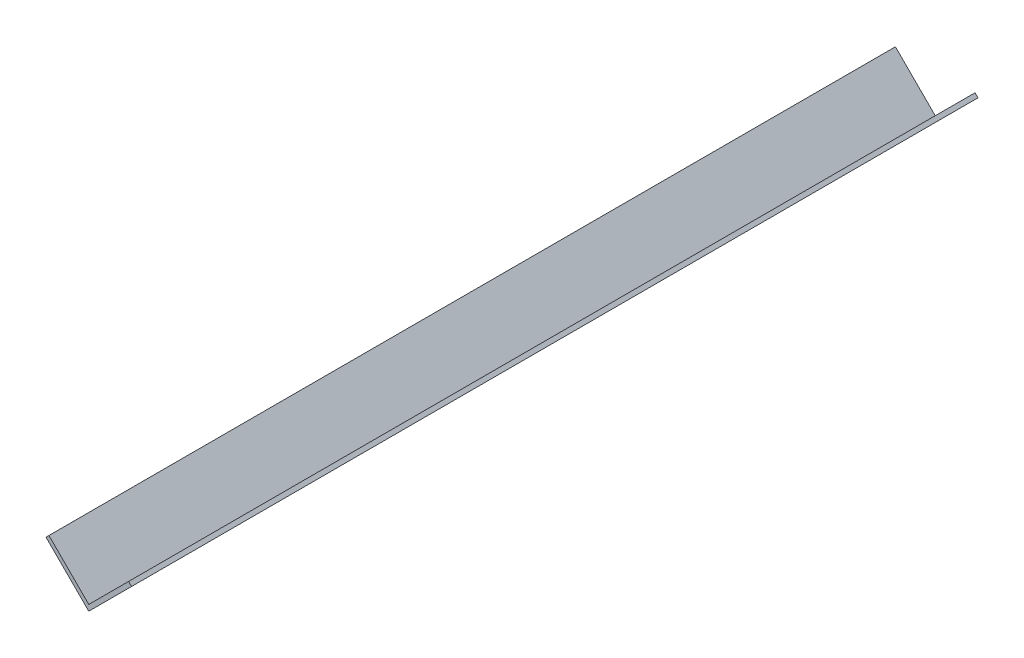
ISO-10303-21;
HEADER;
FILE_DESCRIPTION(('STEP AP214'),'2;1');
FILE_NAME('part.step','',(''),(''),'','','');
FILE_SCHEMA(('AUTOMOTIVE_DESIGN { 1 0 10303 214 1 1 1 1 }'));
ENDSEC;
DATA;
#1=APPLICATION_CONTEXT('core data for automotive mechanical design processes');
#2=APPLICATION_PROTOCOL_DEFINITION('international standard','automotive_design',2000,#1);
#3=PRODUCT_CONTEXT('',#1,'mechanical');
#4=PRODUCT('Part','Part','',(#3));
#5=PRODUCT_RELATED_PRODUCT_CATEGORY('part','',(#4));
#6=PRODUCT_DEFINITION_FORMATION('','',#4);
#7=PRODUCT_DEFINITION_CONTEXT('part definition',#1,'design');
#8=PRODUCT_DEFINITION('design','',#6,#7);
#9=PRODUCT_DEFINITION_SHAPE('','',#8);
#10=(LENGTH_UNIT() NAMED_UNIT(*) SI_UNIT(.MILLI.,.METRE.));
#11=(NAMED_UNIT(*) PLANE_ANGLE_UNIT() SI_UNIT($,.RADIAN.));
#12=(NAMED_UNIT(*) SI_UNIT($,.STERADIAN.) SOLID_ANGLE_UNIT());
#13=UNCERTAINTY_MEASURE_WITH_UNIT(LENGTH_MEASURE(1.E-05),#10,'distance_accuracy_value','');
#14=(GEOMETRIC_REPRESENTATION_CONTEXT(3) GLOBAL_UNCERTAINTY_ASSIGNED_CONTEXT((#13)) GLOBAL_UNIT_ASSIGNED_CONTEXT((#10,
#11,#12)) REPRESENTATION_CONTEXT('',''));
#15=CARTESIAN_POINT('',(0.,0.,0.));
#16=DIRECTION('',(0.,0.,1.));
#17=DIRECTION('',(1.,0.,0.));
#18=AXIS2_PLACEMENT_3D('',#15,#16,#17);
#19=CARTESIAN_POINT('',(17.9605122421382,17.9605122421384,355.6));
#20=DIRECTION('',(-0.707106781186551,0.707106781186544,0.));
#21=DIRECTION('',(-0.707106781186544,-0.707106781186551,0.));
#22=AXIS2_PLACEMENT_3D('',#19,#20,#21);
#23=PLANE('',#22);
#24=DIRECTION('',(0.707106781186544,0.707106781186551,0.));
#25=VECTOR('',#24,1.);
#26=CARTESIAN_POINT('',(17.9605122421382,17.9605122421384,0.));
#27=LINE('',#26,#25);
#28=CARTESIAN_POINT('',(0.,0.,0.));
#29=VERTEX_POINT('',#28);
#30=CARTESIAN_POINT('',(17.9605122421382,17.9605122421384,0.));
#31=VERTEX_POINT('',#30);
#32=EDGE_CURVE('E133',#29,#31,#27,.T.);
#33=ORIENTED_EDGE('',*,*,#32,.T.);
#34=DIRECTION('',(0.,0.,-1.));
#35=VECTOR('',#34,1.);
#36=CARTESIAN_POINT('',(17.9605122421382,17.9605122421384,355.6));
#37=LINE('',#36,#35);
#38=CARTESIAN_POINT('',(17.9605122421382,17.9605122421384,355.6));
#39=VERTEX_POINT('',#38);
#40=EDGE_CURVE('E11',#39,#31,#37,.T.);
#41=ORIENTED_EDGE('',*,*,#40,.F.);
#42=DIRECTION('',(0.707106781186544,0.707106781186551,0.));
#43=VECTOR('',#42,1.);
#44=CARTESIAN_POINT('',(17.9605122421382,17.9605122421384,355.6));
#45=LINE('',#44,#43);
#46=CARTESIAN_POINT('',(0.,0.,355.6));
#47=VERTEX_POINT('',#46);
#48=EDGE_CURVE('E149',#47,#39,#45,.T.);
#49=ORIENTED_EDGE('',*,*,#48,.F.);
#50=DIRECTION('',(0.,0.,-1.));
#51=VECTOR('',#50,1.);
#52=CARTESIAN_POINT('',(0.,0.,355.6));
#53=LINE('',#52,#51);
#54=EDGE_CURVE('E129',#47,#29,#53,.T.);
#55=ORIENTED_EDGE('',*,*,#54,.T.);
#56=EDGE_LOOP('',(#33,#41,#49,#55));
#57=FACE_BOUND('',#56,.T.);
#58=ADVANCED_FACE('F44',(#57),#23,.F.);
#59=CARTESIAN_POINT('',(16.7257270254913,19.1952974587853,355.6));
#60=DIRECTION('',(-0.707106781186546,-0.707106781186548,0.));
#61=DIRECTION('',(0.707106781186549,-0.707106781186547,0.));
#62=AXIS2_PLACEMENT_3D('',#59,#60,#61);
#63=PLANE('',#62);
#64=DIRECTION('',(-0.707106781186549,0.707106781186547,0.));
#65=VECTOR('',#64,1.);
#66=CARTESIAN_POINT('',(16.7257270254913,19.1952974587853,0.));
#67=LINE('',#66,#65);
#68=CARTESIAN_POINT('',(16.7257270254913,19.1952974587853,0.));
#69=VERTEX_POINT('',#68);
#70=EDGE_CURVE('E137',#31,#69,#67,.T.);
#71=ORIENTED_EDGE('',*,*,#70,.T.);
#72=DIRECTION('',(0.,0.,-1.));
#73=VECTOR('',#72,1.);
#74=CARTESIAN_POINT('',(16.7257270254913,19.1952974587853,355.6));
#75=LINE('',#74,#73);
#76=CARTESIAN_POINT('',(16.7257270254913,19.1952974587853,355.6));
#77=VERTEX_POINT('',#76);
#78=EDGE_CURVE('E53',#77,#69,#75,.T.);
#79=ORIENTED_EDGE('',*,*,#78,.F.);
#80=DIRECTION('',(-0.707106781186549,0.707106781186547,0.));
#81=VECTOR('',#80,1.);
#82=CARTESIAN_POINT('',(16.7257270254913,19.1952974587853,355.6));
#83=LINE('',#82,#81);
#84=EDGE_CURVE('E98',#39,#77,#83,.T.);
#85=ORIENTED_EDGE('',*,*,#84,.F.);
#86=ORIENTED_EDGE('',*,*,#40,.T.);
#87=EDGE_LOOP('',(#71,#79,#85,#86));
#88=FACE_BOUND('',#87,.T.);
#89=ADVANCED_FACE('F177',(#88),#63,.F.);
#90=CARTESIAN_POINT('',(0.,2.46957043329402,355.6));
#91=DIRECTION('',(0.707106781186547,-0.707106781186548,0.));
#92=DIRECTION('',(0.707106781186548,0.707106781186547,0.));
#93=AXIS2_PLACEMENT_3D('',#90,#91,#92);
#94=PLANE('',#93);
#95=DIRECTION('',(-0.707106781186548,-0.707106781186547,0.));
#96=VECTOR('',#95,1.);
#97=CARTESIAN_POINT('',(0.,2.46957043329402,0.));
#98=LINE('',#97,#96);
#99=CARTESIAN_POINT('',(0.,2.46957043329402,0.));
#100=VERTEX_POINT('',#99);
#101=EDGE_CURVE('E140',#69,#100,#98,.T.);
#102=ORIENTED_EDGE('',*,*,#101,.T.);
#103=DIRECTION('',(0.,0.,-1.));
#104=VECTOR('',#103,1.);
#105=CARTESIAN_POINT('',(0.,2.46957043329402,355.6));
#106=LINE('',#105,#104);
#107=CARTESIAN_POINT('',(0.,2.46957043329402,355.6));
#108=VERTEX_POINT('',#107);
#109=EDGE_CURVE('E122',#108,#100,#106,.T.);
#110=ORIENTED_EDGE('',*,*,#109,.F.);
#111=DIRECTION('',(-0.707106781186548,-0.707106781186547,0.));
#112=VECTOR('',#111,1.);
#113=CARTESIAN_POINT('',(0.,2.46957043329402,355.6));
#114=LINE('',#113,#112);
#115=EDGE_CURVE('E111',#77,#108,#114,.T.);
#116=ORIENTED_EDGE('',*,*,#115,.F.);
#117=ORIENTED_EDGE('',*,*,#78,.T.);
#118=EDGE_LOOP('',(#102,#110,#116,#117));
#119=FACE_BOUND('',#118,.T.);
#120=ADVANCED_FACE('F159',(#119),#94,.F.);
#121=CARTESIAN_POINT('',(-16.7257270254913,19.1952974587853,355.6));
#122=DIRECTION('',(-0.707106781186548,-0.707106781186547,0.));
#123=DIRECTION('',(0.707106781186547,-0.707106781186548,0.));
#124=AXIS2_PLACEMENT_3D('',#121,#122,#123);
#125=PLANE('',#124);
#126=DIRECTION('',(-0.707106781186547,0.707106781186548,0.));
#127=VECTOR('',#126,1.);
#128=CARTESIAN_POINT('',(-16.7257270254913,19.1952974587853,0.));
#129=LINE('',#128,#127);
#130=CARTESIAN_POINT('',(-16.7257270254913,19.1952974587853,0.));
#131=VERTEX_POINT('',#130);
#132=EDGE_CURVE('E120',#100,#131,#129,.T.);
#133=ORIENTED_EDGE('',*,*,#132,.T.);
#134=DIRECTION('',(0.,0.,-1.));
#135=VECTOR('',#134,1.);
#136=CARTESIAN_POINT('',(-16.7257270254913,19.1952974587853,355.6));
#137=LINE('',#136,#135);
#138=CARTESIAN_POINT('',(-16.7257270254913,19.1952974587853,355.6));
#139=VERTEX_POINT('',#138);
#140=EDGE_CURVE('E117',#139,#131,#137,.T.);
#141=ORIENTED_EDGE('',*,*,#140,.F.);
#142=DIRECTION('',(-0.707106781186547,0.707106781186548,0.));
#143=VECTOR('',#142,1.);
#144=CARTESIAN_POINT('',(-16.7257270254913,19.1952974587853,355.6));
#145=LINE('',#144,#143);
#146=EDGE_CURVE('E105',#108,#139,#145,.T.);
#147=ORIENTED_EDGE('',*,*,#146,.F.);
#148=ORIENTED_EDGE('',*,*,#109,.T.);
#149=EDGE_LOOP('',(#133,#141,#147,#148));
#150=FACE_BOUND('',#149,.T.);
#151=ADVANCED_FACE('F118',(#150),#125,.F.);
#152=CARTESIAN_POINT('',(-17.9605122421384,17.9605122421382,355.6));
#153=DIRECTION('',(0.707106781186548,-0.707106781186546,0.));
#154=DIRECTION('',(0.707106781186547,0.707106781186548,0.));
#155=AXIS2_PLACEMENT_3D('',#152,#153,#154);
#156=PLANE('',#155);
#157=DIRECTION('',(-0.707106781186547,-0.707106781186549,0.));
#158=VECTOR('',#157,1.);
#159=CARTESIAN_POINT('',(-17.9605122421384,17.9605122421382,0.));
#160=LINE('',#159,#158);
#161=CARTESIAN_POINT('',(-17.9605122421384,17.9605122421382,0.));
#162=VERTEX_POINT('',#161);
#163=EDGE_CURVE('E84',#131,#162,#160,.T.);
#164=ORIENTED_EDGE('',*,*,#163,.T.);
#165=DIRECTION('',(0.,0.,-1.));
#166=VECTOR('',#165,1.);
#167=CARTESIAN_POINT('',(-17.9605122421384,17.9605122421382,355.6));
#168=LINE('',#167,#166);
#169=CARTESIAN_POINT('',(-17.9605122421384,17.9605122421382,355.6));
#170=VERTEX_POINT('',#169);
#171=EDGE_CURVE('E123',#170,#162,#168,.T.);
#172=ORIENTED_EDGE('',*,*,#171,.F.);
#173=DIRECTION('',(-0.707106781186547,-0.707106781186549,0.));
#174=VECTOR('',#173,1.);
#175=CARTESIAN_POINT('',(-17.9605122421384,17.9605122421382,355.6));
#176=LINE('',#175,#174);
#177=EDGE_CURVE('E109',#139,#170,#176,.T.);
#178=ORIENTED_EDGE('',*,*,#177,.F.);
#179=ORIENTED_EDGE('',*,*,#140,.T.);
#180=EDGE_LOOP('',(#164,#172,#178,#179));
#181=FACE_BOUND('',#180,.T.);
#182=ADVANCED_FACE('F125',(#181),#156,.F.);
#183=CARTESIAN_POINT('',(0.,0.,355.6));
#184=DIRECTION('',(0.707106781186544,0.707106781186551,0.));
#185=DIRECTION('',(-0.707106781186551,0.707106781186544,0.));
#186=AXIS2_PLACEMENT_3D('',#183,#184,#185);
#187=PLANE('',#186);
#188=DIRECTION('',(0.707106781186551,-0.707106781186544,0.));
#189=VECTOR('',#188,1.);
#190=CARTESIAN_POINT('',(0.,0.,0.));
#191=LINE('',#190,#189);
#192=EDGE_CURVE('E90',#162,#29,#191,.T.);
#193=ORIENTED_EDGE('',*,*,#192,.T.);
#194=ORIENTED_EDGE('',*,*,#54,.F.);
#195=DIRECTION('',(0.707106781186551,-0.707106781186544,0.));
#196=VECTOR('',#195,1.);
#197=CARTESIAN_POINT('',(0.,0.,355.6));
#198=LINE('',#197,#196);
#199=EDGE_CURVE('E61',#170,#47,#198,.T.);
#200=ORIENTED_EDGE('',*,*,#199,.F.);
#201=ORIENTED_EDGE('',*,*,#171,.T.);
#202=EDGE_LOOP('',(#193,#194,#200,#201));
#203=FACE_BOUND('',#202,.T.);
#204=ADVANCED_FACE('F166',(#203),#187,.F.);
#205=CARTESIAN_POINT('',(0.,0.,355.6));
#206=DIRECTION('',(0.,0.,-1.));
#207=DIRECTION('',(-1.,0.,0.));
#208=AXIS2_PLACEMENT_3D('',#205,#206,#207);
#209=PLANE('',#208);
#210=ORIENTED_EDGE('',*,*,#48,.T.);
#211=ORIENTED_EDGE('',*,*,#84,.T.);
#212=ORIENTED_EDGE('',*,*,#115,.T.);
#213=ORIENTED_EDGE('',*,*,#146,.T.);
#214=ORIENTED_EDGE('',*,*,#177,.T.);
#215=ORIENTED_EDGE('',*,*,#199,.T.);
#216=EDGE_LOOP('',(#210,#211,#212,#213,#214,#215));
#217=FACE_BOUND('',#216,.T.);
#218=ADVANCED_FACE('F107',(#217),#209,.F.);
#219=CARTESIAN_POINT('',(0.,0.,0.));
#220=DIRECTION('',(0.,0.,-1.));
#221=DIRECTION('',(-1.,0.,0.));
#222=AXIS2_PLACEMENT_3D('',#219,#220,#221);
#223=PLANE('',#222);
#224=ORIENTED_EDGE('',*,*,#32,.F.);
#225=ORIENTED_EDGE('',*,*,#192,.F.);
#226=ORIENTED_EDGE('',*,*,#163,.F.);
#227=ORIENTED_EDGE('',*,*,#132,.F.);
#228=ORIENTED_EDGE('',*,*,#101,.F.);
#229=ORIENTED_EDGE('',*,*,#70,.F.);
#230=EDGE_LOOP('',(#224,#225,#226,#227,#228,#229));
#231=FACE_BOUND('',#230,.T.);
#232=ADVANCED_FACE('F162',(#231),#223,.T.);
#233=CLOSED_SHELL('',(#58,#89,#120,#151,#182,#204,#218,#232));
#234=MANIFOLD_SOLID_BREP('B2',#233);
#235=ADVANCED_BREP_SHAPE_REPRESENTATION('',(#18,#234),#14);
#236=SHAPE_DEFINITION_REPRESENTATION(#9,#235);
ENDSEC;
END-ISO-10303-21;
